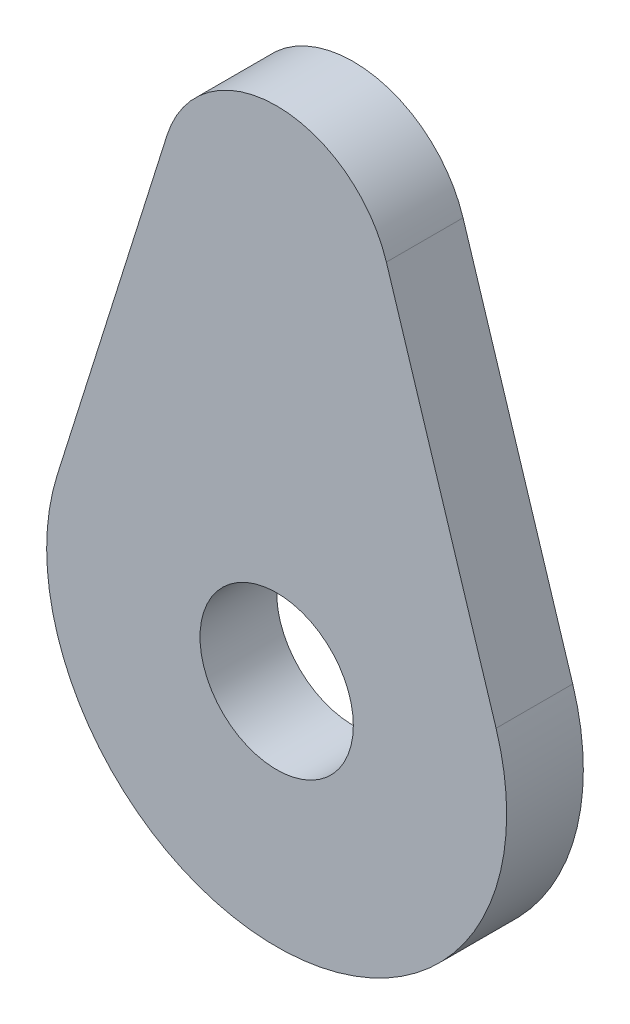
ISO-10303-21;
HEADER;
FILE_DESCRIPTION(('STEP AP214'),'2;1');
FILE_NAME('part.step','',(''),(''),'','','');
FILE_SCHEMA(('AUTOMOTIVE_DESIGN { 1 0 10303 214 1 1 1 1 }'));
ENDSEC;
DATA;
#1=APPLICATION_CONTEXT('core data for automotive mechanical design processes');
#2=APPLICATION_PROTOCOL_DEFINITION('international standard','automotive_design',2000,#1);
#3=PRODUCT_CONTEXT('',#1,'mechanical');
#4=PRODUCT('Part','Part','',(#3));
#5=PRODUCT_RELATED_PRODUCT_CATEGORY('part','',(#4));
#6=PRODUCT_DEFINITION_FORMATION('','',#4);
#7=PRODUCT_DEFINITION_CONTEXT('part definition',#1,'design');
#8=PRODUCT_DEFINITION('design','',#6,#7);
#9=PRODUCT_DEFINITION_SHAPE('','',#8);
#10=(LENGTH_UNIT() NAMED_UNIT(*) SI_UNIT(.MILLI.,.METRE.));
#11=(NAMED_UNIT(*) PLANE_ANGLE_UNIT() SI_UNIT($,.RADIAN.));
#12=(NAMED_UNIT(*) SI_UNIT($,.STERADIAN.) SOLID_ANGLE_UNIT());
#13=UNCERTAINTY_MEASURE_WITH_UNIT(LENGTH_MEASURE(1.E-05),#10,'distance_accuracy_value','');
#14=(GEOMETRIC_REPRESENTATION_CONTEXT(3) GLOBAL_UNCERTAINTY_ASSIGNED_CONTEXT((#13)) GLOBAL_UNIT_ASSIGNED_CONTEXT((#10,
#11,#12)) REPRESENTATION_CONTEXT('',''));
#15=CARTESIAN_POINT('',(0.,0.,0.));
#16=DIRECTION('',(0.,0.,1.));
#17=DIRECTION('',(1.,0.,0.));
#18=AXIS2_PLACEMENT_3D('',#15,#16,#17);
#19=CARTESIAN_POINT('',(0.,50.,5.));
#20=DIRECTION('',(0.,0.,1.));
#21=DIRECTION('',(1.,0.,0.));
#22=AXIS2_PLACEMENT_3D('',#19,#20,#21);
#23=PLANE('',#22);
#24=CARTESIAN_POINT('',(0.,50.,5.));
#25=DIRECTION('',(0.,0.,1.));
#26=DIRECTION('',(1.,0.,0.));
#27=AXIS2_PLACEMENT_3D('',#24,#25,#26);
#28=CIRCLE('',#27,15.);
#29=CARTESIAN_POINT('',(14.3090880212542,54.5,5.));
#30=VERTEX_POINT('',#29);
#31=CARTESIAN_POINT('',(-14.3090880212542,54.5,5.));
#32=VERTEX_POINT('',#31);
#33=EDGE_CURVE('E106',#30,#32,#28,.T.);
#34=ORIENTED_EDGE('',*,*,#33,.T.);
#35=DIRECTION('',(-0.3,-0.953939201416946,0.));
#36=VECTOR('',#35,1.);
#37=CARTESIAN_POINT('',(-14.3090880212542,54.5,5.));
#38=LINE('',#37,#36);
#39=CARTESIAN_POINT('',(-28.6181760425084,9.,5.));
#40=VERTEX_POINT('',#39);
#41=EDGE_CURVE('E99',#32,#40,#38,.T.);
#42=ORIENTED_EDGE('',*,*,#41,.T.);
#43=CARTESIAN_POINT('',(0.,0.,5.));
#44=DIRECTION('',(0.,0.,1.));
#45=DIRECTION('',(1.,0.,0.));
#46=AXIS2_PLACEMENT_3D('',#43,#44,#45);
#47=CIRCLE('',#46,30.);
#48=CARTESIAN_POINT('',(28.6181760425084,9.00000000000006,5.));
#49=VERTEX_POINT('',#48);
#50=EDGE_CURVE('E105',#40,#49,#47,.T.);
#51=ORIENTED_EDGE('',*,*,#50,.T.);
#52=DIRECTION('',(0.3,-0.953939201416946,0.));
#53=VECTOR('',#52,1.);
#54=CARTESIAN_POINT('',(14.3090880212542,54.5,5.));
#55=LINE('',#54,#53);
#56=EDGE_CURVE('E118',#30,#49,#55,.T.);
#57=ORIENTED_EDGE('',*,*,#56,.F.);
#58=EDGE_LOOP('',(#34,#42,#51,#57));
#59=FACE_BOUND('',#58,.T.);
#60=CARTESIAN_POINT('',(0.,0.,5.));
#61=DIRECTION('',(0.,0.,1.));
#62=DIRECTION('',(1.,0.,0.));
#63=AXIS2_PLACEMENT_3D('',#60,#61,#62);
#64=CIRCLE('',#63,10.);
#65=CARTESIAN_POINT('',(10.,0.,5.));
#66=VERTEX_POINT('',#65);
#67=EDGE_CURVE('E127',#66,#66,#64,.T.);
#68=ORIENTED_EDGE('',*,*,#67,.F.);
#69=EDGE_LOOP('',(#68));
#70=FACE_BOUND('',#69,.T.);
#71=ADVANCED_FACE('F55',(#59,#70),#23,.T.);
#72=CARTESIAN_POINT('',(0.,50.,-5.));
#73=DIRECTION('',(0.,0.,1.));
#74=DIRECTION('',(1.,0.,0.));
#75=AXIS2_PLACEMENT_3D('',#72,#73,#74);
#76=PLANE('',#75);
#77=CARTESIAN_POINT('',(0.,50.,-5.));
#78=DIRECTION('',(0.,0.,1.));
#79=DIRECTION('',(1.,0.,0.));
#80=AXIS2_PLACEMENT_3D('',#77,#78,#79);
#81=CIRCLE('',#80,15.);
#82=CARTESIAN_POINT('',(14.3090880212542,54.5,-5.));
#83=VERTEX_POINT('',#82);
#84=CARTESIAN_POINT('',(-14.3090880212542,54.5,-5.));
#85=VERTEX_POINT('',#84);
#86=EDGE_CURVE('E124',#83,#85,#81,.T.);
#87=ORIENTED_EDGE('',*,*,#86,.F.);
#88=DIRECTION('',(0.3,-0.953939201416946,0.));
#89=VECTOR('',#88,1.);
#90=CARTESIAN_POINT('',(14.3090880212542,54.5,-5.));
#91=LINE('',#90,#89);
#92=CARTESIAN_POINT('',(28.6181760425084,9.00000000000006,-5.));
#93=VERTEX_POINT('',#92);
#94=EDGE_CURVE('E133',#83,#93,#91,.T.);
#95=ORIENTED_EDGE('',*,*,#94,.T.);
#96=CARTESIAN_POINT('',(0.,0.,-5.));
#97=DIRECTION('',(0.,0.,1.));
#98=DIRECTION('',(1.,0.,0.));
#99=AXIS2_PLACEMENT_3D('',#96,#97,#98);
#100=CIRCLE('',#99,30.);
#101=CARTESIAN_POINT('',(-28.6181760425084,9.,-5.));
#102=VERTEX_POINT('',#101);
#103=EDGE_CURVE('E130',#102,#93,#100,.T.);
#104=ORIENTED_EDGE('',*,*,#103,.F.);
#105=DIRECTION('',(-0.3,-0.953939201416946,0.));
#106=VECTOR('',#105,1.);
#107=CARTESIAN_POINT('',(-14.3090880212542,54.5,-5.));
#108=LINE('',#107,#106);
#109=EDGE_CURVE('E112',#85,#102,#108,.T.);
#110=ORIENTED_EDGE('',*,*,#109,.F.);
#111=EDGE_LOOP('',(#87,#95,#104,#110));
#112=FACE_BOUND('',#111,.T.);
#113=CARTESIAN_POINT('',(0.,0.,-5.));
#114=DIRECTION('',(0.,0.,1.));
#115=DIRECTION('',(1.,0.,0.));
#116=AXIS2_PLACEMENT_3D('',#113,#114,#115);
#117=CIRCLE('',#116,10.);
#118=CARTESIAN_POINT('',(10.,0.,-5.));
#119=VERTEX_POINT('',#118);
#120=EDGE_CURVE('E143',#119,#119,#117,.T.);
#121=ORIENTED_EDGE('',*,*,#120,.T.);
#122=EDGE_LOOP('',(#121));
#123=FACE_BOUND('',#122,.T.);
#124=ADVANCED_FACE('F154',(#112,#123),#76,.F.);
#125=CARTESIAN_POINT('',(0.,50.,5.));
#126=DIRECTION('',(0.,0.,-1.));
#127=DIRECTION('',(-1.,0.,0.));
#128=AXIS2_PLACEMENT_3D('',#125,#126,#127);
#129=CYLINDRICAL_SURFACE('',#128,15.);
#130=ORIENTED_EDGE('',*,*,#86,.T.);
#131=DIRECTION('',(0.,0.,-1.));
#132=VECTOR('',#131,1.);
#133=CARTESIAN_POINT('',(-14.3090880212542,54.5,5.));
#134=LINE('',#133,#132);
#135=EDGE_CURVE('E12',#32,#85,#134,.T.);
#136=ORIENTED_EDGE('',*,*,#135,.F.);
#137=ORIENTED_EDGE('',*,*,#33,.F.);
#138=DIRECTION('',(0.,0.,-1.));
#139=VECTOR('',#138,1.);
#140=CARTESIAN_POINT('',(14.3090880212542,54.5,5.));
#141=LINE('',#140,#139);
#142=EDGE_CURVE('E73',#30,#83,#141,.T.);
#143=ORIENTED_EDGE('',*,*,#142,.T.);
#144=EDGE_LOOP('',(#130,#136,#137,#143));
#145=FACE_BOUND('',#144,.T.);
#146=ADVANCED_FACE('F57',(#145),#129,.T.);
#147=CARTESIAN_POINT('',(-14.3090880212542,54.5,5.));
#148=DIRECTION('',(0.953939201416946,-0.3,0.));
#149=DIRECTION('',(0.3,0.953939201416946,0.));
#150=AXIS2_PLACEMENT_3D('',#147,#148,#149);
#151=PLANE('',#150);
#152=ORIENTED_EDGE('',*,*,#109,.T.);
#153=DIRECTION('',(0.,0.,-1.));
#154=VECTOR('',#153,1.);
#155=CARTESIAN_POINT('',(-28.6181760425084,9.,5.));
#156=LINE('',#155,#154);
#157=EDGE_CURVE('E65',#40,#102,#156,.T.);
#158=ORIENTED_EDGE('',*,*,#157,.F.);
#159=ORIENTED_EDGE('',*,*,#41,.F.);
#160=ORIENTED_EDGE('',*,*,#135,.T.);
#161=EDGE_LOOP('',(#152,#158,#159,#160));
#162=FACE_BOUND('',#161,.T.);
#163=ADVANCED_FACE('F111',(#162),#151,.F.);
#164=CARTESIAN_POINT('',(0.,0.,5.));
#165=DIRECTION('',(0.,0.,-1.));
#166=DIRECTION('',(-1.,0.,0.));
#167=AXIS2_PLACEMENT_3D('',#164,#165,#166);
#168=CYLINDRICAL_SURFACE('',#167,30.);
#169=ORIENTED_EDGE('',*,*,#103,.T.);
#170=DIRECTION('',(0.,0.,-1.));
#171=VECTOR('',#170,1.);
#172=CARTESIAN_POINT('',(28.6181760425084,9.00000000000006,5.));
#173=LINE('',#172,#171);
#174=EDGE_CURVE('E88',#49,#93,#173,.T.);
#175=ORIENTED_EDGE('',*,*,#174,.F.);
#176=ORIENTED_EDGE('',*,*,#50,.F.);
#177=ORIENTED_EDGE('',*,*,#157,.T.);
#178=EDGE_LOOP('',(#169,#175,#176,#177));
#179=FACE_BOUND('',#178,.T.);
#180=ADVANCED_FACE('F116',(#179),#168,.T.);
#181=CARTESIAN_POINT('',(14.3090880212542,54.5,5.));
#182=DIRECTION('',(0.953939201416946,0.3,0.));
#183=DIRECTION('',(-0.3,0.953939201416946,0.));
#184=AXIS2_PLACEMENT_3D('',#181,#182,#183);
#185=PLANE('',#184);
#186=ORIENTED_EDGE('',*,*,#94,.F.);
#187=ORIENTED_EDGE('',*,*,#142,.F.);
#188=ORIENTED_EDGE('',*,*,#56,.T.);
#189=ORIENTED_EDGE('',*,*,#174,.T.);
#190=EDGE_LOOP('',(#186,#187,#188,#189));
#191=FACE_BOUND('',#190,.T.);
#192=ADVANCED_FACE('F162',(#191),#185,.T.);
#193=CARTESIAN_POINT('',(0.,0.,5.));
#194=DIRECTION('',(0.,0.,-1.));
#195=DIRECTION('',(-1.,0.,0.));
#196=AXIS2_PLACEMENT_3D('',#193,#194,#195);
#197=CYLINDRICAL_SURFACE('',#196,10.);
#198=ORIENTED_EDGE('',*,*,#67,.T.);
#199=EDGE_LOOP('',(#198));
#200=FACE_BOUND('',#199,.T.);
#201=ORIENTED_EDGE('',*,*,#120,.F.);
#202=EDGE_LOOP('',(#201));
#203=FACE_BOUND('',#202,.T.);
#204=ADVANCED_FACE('F151',(#200,#203),#197,.F.);
#205=CLOSED_SHELL('',(#71,#124,#146,#163,#180,#192,#204));
#206=MANIFOLD_SOLID_BREP('B2',#205);
#207=ADVANCED_BREP_SHAPE_REPRESENTATION('',(#18,#206),#14);
#208=SHAPE_DEFINITION_REPRESENTATION(#9,#207);
ENDSEC;
END-ISO-10303-21;
